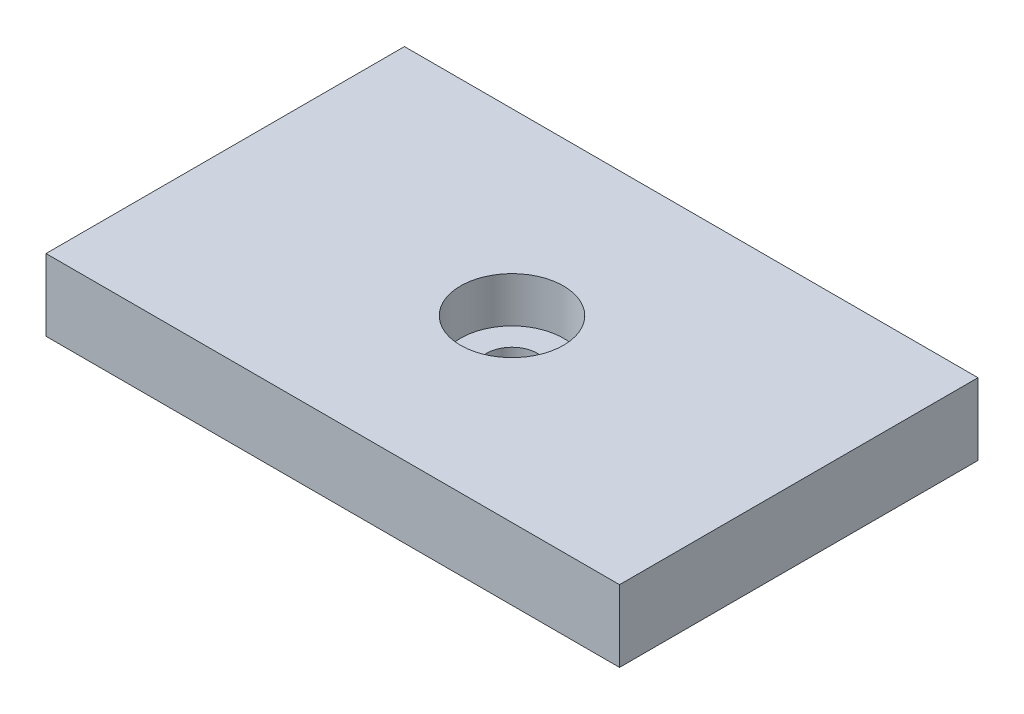
ISO-10303-21;
HEADER;
FILE_DESCRIPTION(('STEP AP214'),'2;1');
FILE_NAME('part.step','',(''),(''),'','','');
FILE_SCHEMA(('AUTOMOTIVE_DESIGN { 1 0 10303 214 1 1 1 1 }'));
ENDSEC;
DATA;
#1=APPLICATION_CONTEXT('core data for automotive mechanical design processes');
#2=APPLICATION_PROTOCOL_DEFINITION('international standard','automotive_design',2000,#1);
#3=PRODUCT_CONTEXT('',#1,'mechanical');
#4=PRODUCT('Part','Part','',(#3));
#5=PRODUCT_RELATED_PRODUCT_CATEGORY('part','',(#4));
#6=PRODUCT_DEFINITION_FORMATION('','',#4);
#7=PRODUCT_DEFINITION_CONTEXT('part definition',#1,'design');
#8=PRODUCT_DEFINITION('design','',#6,#7);
#9=PRODUCT_DEFINITION_SHAPE('','',#8);
#10=(LENGTH_UNIT() NAMED_UNIT(*) SI_UNIT(.MILLI.,.METRE.));
#11=(NAMED_UNIT(*) PLANE_ANGLE_UNIT() SI_UNIT($,.RADIAN.));
#12=(NAMED_UNIT(*) SI_UNIT($,.STERADIAN.) SOLID_ANGLE_UNIT());
#13=UNCERTAINTY_MEASURE_WITH_UNIT(LENGTH_MEASURE(1.E-05),#10,'distance_accuracy_value','');
#14=(GEOMETRIC_REPRESENTATION_CONTEXT(3) GLOBAL_UNCERTAINTY_ASSIGNED_CONTEXT((#13)) GLOBAL_UNIT_ASSIGNED_CONTEXT((#10,
#11,#12)) REPRESENTATION_CONTEXT('',''));
#15=CARTESIAN_POINT('',(0.,0.,0.));
#16=DIRECTION('',(0.,0.,1.));
#17=DIRECTION('',(1.,0.,0.));
#18=AXIS2_PLACEMENT_3D('',#15,#16,#17);
#19=CARTESIAN_POINT('',(-25.4,6.35,0.));
#20=DIRECTION('',(1.,0.,0.));
#21=DIRECTION('',(0.,0.,-1.));
#22=AXIS2_PLACEMENT_3D('',#19,#20,#21);
#23=PLANE('',#22);
#24=DIRECTION('',(0.,0.,1.));
#25=VECTOR('',#24,1.);
#26=CARTESIAN_POINT('',(-25.4,0.,0.));
#27=LINE('',#26,#25);
#28=CARTESIAN_POINT('',(-25.4,0.,-15.875));
#29=VERTEX_POINT('',#28);
#30=CARTESIAN_POINT('',(-25.4,0.,15.875));
#31=VERTEX_POINT('',#30);
#32=EDGE_CURVE('E111',#29,#31,#27,.T.);
#33=ORIENTED_EDGE('',*,*,#32,.T.);
#34=DIRECTION('',(0.,-1.,0.));
#35=VECTOR('',#34,1.);
#36=CARTESIAN_POINT('',(-25.4,6.35,15.875));
#37=LINE('',#36,#35);
#38=CARTESIAN_POINT('',(-25.4,6.35,15.875));
#39=VERTEX_POINT('',#38);
#40=EDGE_CURVE('E49',#39,#31,#37,.T.);
#41=ORIENTED_EDGE('',*,*,#40,.F.);
#42=DIRECTION('',(0.,0.,1.));
#43=VECTOR('',#42,1.);
#44=CARTESIAN_POINT('',(-25.4,6.35,0.));
#45=LINE('',#44,#43);
#46=CARTESIAN_POINT('',(-25.4,6.35,-15.875));
#47=VERTEX_POINT('',#46);
#48=EDGE_CURVE('E91',#47,#39,#45,.T.);
#49=ORIENTED_EDGE('',*,*,#48,.F.);
#50=DIRECTION('',(0.,-1.,0.));
#51=VECTOR('',#50,1.);
#52=CARTESIAN_POINT('',(-25.4,6.35,-15.875));
#53=LINE('',#52,#51);
#54=EDGE_CURVE('E57',#47,#29,#53,.T.);
#55=ORIENTED_EDGE('',*,*,#54,.T.);
#56=EDGE_LOOP('',(#33,#41,#49,#55));
#57=FACE_BOUND('',#56,.T.);
#58=ADVANCED_FACE('F39',(#57),#23,.F.);
#59=CARTESIAN_POINT('',(0.,6.35,15.875));
#60=DIRECTION('',(0.,0.,-1.));
#61=DIRECTION('',(-1.,0.,0.));
#62=AXIS2_PLACEMENT_3D('',#59,#60,#61);
#63=PLANE('',#62);
#64=DIRECTION('',(1.,0.,0.));
#65=VECTOR('',#64,1.);
#66=CARTESIAN_POINT('',(0.,0.,15.875));
#67=LINE('',#66,#65);
#68=CARTESIAN_POINT('',(25.4,0.,15.875));
#69=VERTEX_POINT('',#68);
#70=EDGE_CURVE('E98',#31,#69,#67,.T.);
#71=ORIENTED_EDGE('',*,*,#70,.T.);
#72=DIRECTION('',(0.,-1.,0.));
#73=VECTOR('',#72,1.);
#74=CARTESIAN_POINT('',(25.4,6.35,15.875));
#75=LINE('',#74,#73);
#76=CARTESIAN_POINT('',(25.4,6.35,15.875));
#77=VERTEX_POINT('',#76);
#78=EDGE_CURVE('E96',#77,#69,#75,.T.);
#79=ORIENTED_EDGE('',*,*,#78,.F.);
#80=DIRECTION('',(1.,0.,0.));
#81=VECTOR('',#80,1.);
#82=CARTESIAN_POINT('',(0.,6.35,15.875));
#83=LINE('',#82,#81);
#84=EDGE_CURVE('E83',#39,#77,#83,.T.);
#85=ORIENTED_EDGE('',*,*,#84,.F.);
#86=ORIENTED_EDGE('',*,*,#40,.T.);
#87=EDGE_LOOP('',(#71,#79,#85,#86));
#88=FACE_BOUND('',#87,.T.);
#89=ADVANCED_FACE('F97',(#88),#63,.F.);
#90=CARTESIAN_POINT('',(25.4,6.35,0.));
#91=DIRECTION('',(1.,0.,0.));
#92=DIRECTION('',(0.,0.,-1.));
#93=AXIS2_PLACEMENT_3D('',#90,#91,#92);
#94=PLANE('',#93);
#95=DIRECTION('',(0.,0.,1.));
#96=VECTOR('',#95,1.);
#97=CARTESIAN_POINT('',(25.4,0.,0.));
#98=LINE('',#97,#96);
#99=CARTESIAN_POINT('',(25.4,0.,-15.875));
#100=VERTEX_POINT('',#99);
#101=EDGE_CURVE('E117',#100,#69,#98,.T.);
#102=ORIENTED_EDGE('',*,*,#101,.F.);
#103=DIRECTION('',(0.,-1.,0.));
#104=VECTOR('',#103,1.);
#105=CARTESIAN_POINT('',(25.4,6.35,-15.875));
#106=LINE('',#105,#104);
#107=CARTESIAN_POINT('',(25.4,6.35,-15.875));
#108=VERTEX_POINT('',#107);
#109=EDGE_CURVE('E71',#108,#100,#106,.T.);
#110=ORIENTED_EDGE('',*,*,#109,.F.);
#111=DIRECTION('',(0.,0.,1.));
#112=VECTOR('',#111,1.);
#113=CARTESIAN_POINT('',(25.4,6.35,0.));
#114=LINE('',#113,#112);
#115=EDGE_CURVE('E90',#108,#77,#114,.T.);
#116=ORIENTED_EDGE('',*,*,#115,.T.);
#117=ORIENTED_EDGE('',*,*,#78,.T.);
#118=EDGE_LOOP('',(#102,#110,#116,#117));
#119=FACE_BOUND('',#118,.T.);
#120=ADVANCED_FACE('F103',(#119),#94,.T.);
#121=CARTESIAN_POINT('',(0.,6.35,0.));
#122=DIRECTION('',(0.,-1.,0.));
#123=DIRECTION('',(0.,0.,-1.));
#124=AXIS2_PLACEMENT_3D('',#121,#122,#123);
#125=CYLINDRICAL_SURFACE('',#124,4.5593);
#126=CARTESIAN_POINT('',(0.,2.3368,0.));
#127=DIRECTION('',(0.,1.,0.));
#128=DIRECTION('',(0.,0.,1.));
#129=AXIS2_PLACEMENT_3D('',#126,#127,#128);
#130=CIRCLE('',#129,4.5593);
#131=CARTESIAN_POINT('',(0.,2.3368,4.5593));
#132=VERTEX_POINT('',#131);
#133=EDGE_CURVE('E11',#132,#132,#130,.T.);
#134=ORIENTED_EDGE('',*,*,#133,.F.);
#135=EDGE_LOOP('',(#134));
#136=FACE_BOUND('',#135,.T.);
#137=CARTESIAN_POINT('',(0.,6.35,0.));
#138=DIRECTION('',(0.,1.,0.));
#139=DIRECTION('',(0.,0.,1.));
#140=AXIS2_PLACEMENT_3D('',#137,#138,#139);
#141=CIRCLE('',#140,4.5593);
#142=CARTESIAN_POINT('',(0.,6.35,4.5593));
#143=VERTEX_POINT('',#142);
#144=EDGE_CURVE('E124',#143,#143,#141,.T.);
#145=ORIENTED_EDGE('',*,*,#144,.T.);
#146=EDGE_LOOP('',(#145));
#147=FACE_BOUND('',#146,.T.);
#148=ADVANCED_FACE('F41',(#136,#147),#125,.F.);
#149=CARTESIAN_POINT('',(0.,6.35,-15.875));
#150=DIRECTION('',(0.,0.,-1.));
#151=DIRECTION('',(-1.,0.,0.));
#152=AXIS2_PLACEMENT_3D('',#149,#150,#151);
#153=PLANE('',#152);
#154=DIRECTION('',(1.,0.,0.));
#155=VECTOR('',#154,1.);
#156=CARTESIAN_POINT('',(0.,0.,-15.875));
#157=LINE('',#156,#155);
#158=EDGE_CURVE('E120',#29,#100,#157,.T.);
#159=ORIENTED_EDGE('',*,*,#158,.F.);
#160=ORIENTED_EDGE('',*,*,#54,.F.);
#161=DIRECTION('',(1.,0.,0.));
#162=VECTOR('',#161,1.);
#163=CARTESIAN_POINT('',(0.,6.35,-15.875));
#164=LINE('',#163,#162);
#165=EDGE_CURVE('E105',#47,#108,#164,.T.);
#166=ORIENTED_EDGE('',*,*,#165,.T.);
#167=ORIENTED_EDGE('',*,*,#109,.T.);
#168=EDGE_LOOP('',(#159,#160,#166,#167));
#169=FACE_BOUND('',#168,.T.);
#170=ADVANCED_FACE('F132',(#169),#153,.T.);
#171=CARTESIAN_POINT('',(0.,6.35,0.));
#172=DIRECTION('',(0.,1.,0.));
#173=DIRECTION('',(0.,0.,1.));
#174=AXIS2_PLACEMENT_3D('',#171,#172,#173);
#175=PLANE('',#174);
#176=ORIENTED_EDGE('',*,*,#144,.F.);
#177=EDGE_LOOP('',(#176));
#178=FACE_BOUND('',#177,.T.);
#179=ORIENTED_EDGE('',*,*,#48,.T.);
#180=ORIENTED_EDGE('',*,*,#84,.T.);
#181=ORIENTED_EDGE('',*,*,#115,.F.);
#182=ORIENTED_EDGE('',*,*,#165,.F.);
#183=EDGE_LOOP('',(#179,#180,#181,#182));
#184=FACE_BOUND('',#183,.T.);
#185=ADVANCED_FACE('F87',(#178,#184),#175,.T.);
#186=CARTESIAN_POINT('',(0.,0.,0.));
#187=DIRECTION('',(0.,1.,0.));
#188=DIRECTION('',(0.,0.,1.));
#189=AXIS2_PLACEMENT_3D('',#186,#187,#188);
#190=PLANE('',#189);
#191=ORIENTED_EDGE('',*,*,#32,.F.);
#192=ORIENTED_EDGE('',*,*,#158,.T.);
#193=ORIENTED_EDGE('',*,*,#101,.T.);
#194=ORIENTED_EDGE('',*,*,#70,.F.);
#195=EDGE_LOOP('',(#191,#192,#193,#194));
#196=FACE_BOUND('',#195,.T.);
#197=CARTESIAN_POINT('',(0.,0.,0.));
#198=DIRECTION('',(0.,1.,0.));
#199=DIRECTION('',(0.,0.,1.));
#200=AXIS2_PLACEMENT_3D('',#197,#198,#199);
#201=CIRCLE('',#200,2.2479);
#202=CARTESIAN_POINT('',(0.,0.,2.2479));
#203=VERTEX_POINT('',#202);
#204=EDGE_CURVE('E205',#203,#203,#201,.T.);
#205=ORIENTED_EDGE('',*,*,#204,.T.);
#206=EDGE_LOOP('',(#205));
#207=FACE_BOUND('',#206,.T.);
#208=ADVANCED_FACE('F130',(#196,#207),#190,.F.);
#209=CARTESIAN_POINT('',(0.,2.3368,0.));
#210=DIRECTION('',(0.,-1.,0.));
#211=DIRECTION('',(0.,0.,-1.));
#212=AXIS2_PLACEMENT_3D('',#209,#210,#211);
#213=CYLINDRICAL_SURFACE('',#212,2.2479);
#214=CARTESIAN_POINT('',(0.,2.3368,0.));
#215=DIRECTION('',(0.,1.,0.));
#216=DIRECTION('',(0.,0.,1.));
#217=AXIS2_PLACEMENT_3D('',#214,#215,#216);
#218=CIRCLE('',#217,2.2479);
#219=CARTESIAN_POINT('',(0.,2.3368,2.2479));
#220=VERTEX_POINT('',#219);
#221=EDGE_CURVE('E114',#220,#220,#218,.T.);
#222=ORIENTED_EDGE('',*,*,#221,.T.);
#223=EDGE_LOOP('',(#222));
#224=FACE_BOUND('',#223,.T.);
#225=ORIENTED_EDGE('',*,*,#204,.F.);
#226=EDGE_LOOP('',(#225));
#227=FACE_BOUND('',#226,.T.);
#228=ADVANCED_FACE('F171',(#224,#227),#213,.F.);
#229=CARTESIAN_POINT('',(0.,2.3368,0.));
#230=DIRECTION('',(0.,1.,0.));
#231=DIRECTION('',(0.,0.,1.));
#232=AXIS2_PLACEMENT_3D('',#229,#230,#231);
#233=PLANE('',#232);
#234=ORIENTED_EDGE('',*,*,#221,.F.);
#235=EDGE_LOOP('',(#234));
#236=FACE_BOUND('',#235,.T.);
#237=ORIENTED_EDGE('',*,*,#133,.T.);
#238=EDGE_LOOP('',(#237));
#239=FACE_BOUND('',#238,.T.);
#240=ADVANCED_FACE('F180',(#236,#239),#233,.T.);
#241=CLOSED_SHELL('',(#58,#89,#120,#148,#170,#185,#208,#228,#240));
#242=MANIFOLD_SOLID_BREP('B2',#241);
#243=ADVANCED_BREP_SHAPE_REPRESENTATION('',(#18,#242),#14);
#244=SHAPE_DEFINITION_REPRESENTATION(#9,#243);
ENDSEC;
END-ISO-10303-21;
